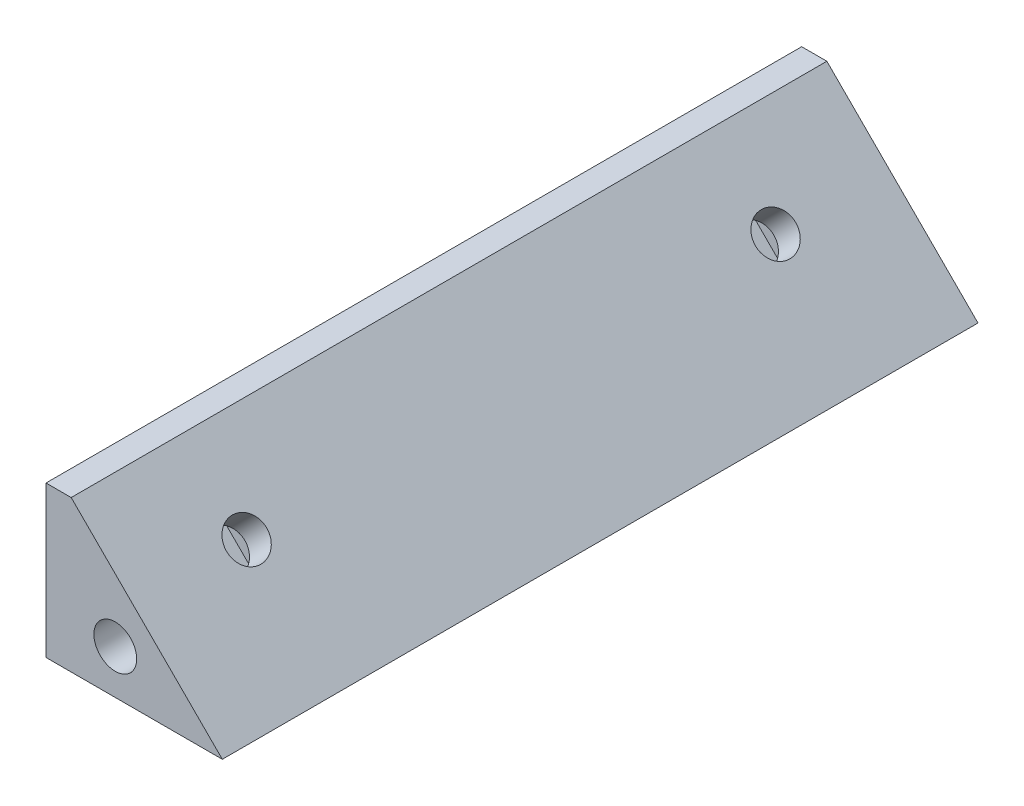
ISO-10303-21;
HEADER;
FILE_DESCRIPTION(('STEP AP214'),'2;1');
FILE_NAME('part.step','',(''),(''),'','','');
FILE_SCHEMA(('AUTOMOTIVE_DESIGN { 1 0 10303 214 1 1 1 1 }'));
ENDSEC;
DATA;
#1=APPLICATION_CONTEXT('core data for automotive mechanical design processes');
#2=APPLICATION_PROTOCOL_DEFINITION('international standard','automotive_design',2000,#1);
#3=PRODUCT_CONTEXT('',#1,'mechanical');
#4=PRODUCT('Part','Part','',(#3));
#5=PRODUCT_RELATED_PRODUCT_CATEGORY('part','',(#4));
#6=PRODUCT_DEFINITION_FORMATION('','',#4);
#7=PRODUCT_DEFINITION_CONTEXT('part definition',#1,'design');
#8=PRODUCT_DEFINITION('design','',#6,#7);
#9=PRODUCT_DEFINITION_SHAPE('','',#8);
#10=(LENGTH_UNIT() NAMED_UNIT(*) SI_UNIT(.MILLI.,.METRE.));
#11=(NAMED_UNIT(*) PLANE_ANGLE_UNIT() SI_UNIT($,.RADIAN.));
#12=(NAMED_UNIT(*) SI_UNIT($,.STERADIAN.) SOLID_ANGLE_UNIT());
#13=UNCERTAINTY_MEASURE_WITH_UNIT(LENGTH_MEASURE(1.E-05),#10,'distance_accuracy_value','');
#14=(GEOMETRIC_REPRESENTATION_CONTEXT(3) GLOBAL_UNCERTAINTY_ASSIGNED_CONTEXT((#13)) GLOBAL_UNIT_ASSIGNED_CONTEXT((#10,
#11,#12)) REPRESENTATION_CONTEXT('',''));
#15=CARTESIAN_POINT('',(0.,0.,0.));
#16=DIRECTION('',(0.,0.,1.));
#17=DIRECTION('',(1.,0.,0.));
#18=AXIS2_PLACEMENT_3D('',#15,#16,#17);
#19=CARTESIAN_POINT('',(4.26758838609296,4.26758838609296,0.));
#20=DIRECTION('',(0.707106781186548,0.707106781186547,0.));
#21=DIRECTION('',(-0.707106781186547,0.707106781186548,0.));
#22=AXIS2_PLACEMENT_3D('',#19,#20,#21);
#23=PLANE('',#22);
#24=CARTESIAN_POINT('',(3.19652057422748,5.33865619795844,9.));
#25=DIRECTION('',(0.707106781186548,0.707106781186547,0.));
#26=DIRECTION('',(-0.707106781186547,0.707106781186548,0.));
#27=AXIS2_PLACEMENT_3D('',#24,#25,#26);
#28=CIRCLE('',#27,1.6);
#29=CARTESIAN_POINT('',(2.06514972432901,6.47002704785692,9.));
#30=VERTEX_POINT('',#29);
#31=EDGE_CURVE('E362',#30,#30,#28,.T.);
#32=ORIENTED_EDGE('',*,*,#31,.T.);
#33=EDGE_LOOP('',(#32));
#34=FACE_BOUND('',#33,.T.);
#35=DIRECTION('',(-0.707106781186547,0.707106781186548,0.));
#36=VECTOR('',#35,1.);
#37=CARTESIAN_POINT('',(4.26758838609296,4.26758838609296,6.175));
#38=LINE('',#37,#36);
#39=CARTESIAN_POINT('',(8.53517677218592,0.,6.175));
#40=VERTEX_POINT('',#39);
#41=CARTESIAN_POINT('',(2.04321915366707,6.49195761851885,6.175));
#42=VERTEX_POINT('',#41);
#43=EDGE_CURVE('E373',#40,#42,#38,.T.);
#44=ORIENTED_EDGE('',*,*,#43,.F.);
#45=DIRECTION('',(0.,0.,1.));
#46=VECTOR('',#45,1.);
#47=CARTESIAN_POINT('',(8.53517677218592,0.,0.));
#48=LINE('',#47,#46);
#49=CARTESIAN_POINT('',(8.53517677218592,0.,11.825));
#50=VERTEX_POINT('',#49);
#51=EDGE_CURVE('E613',#40,#50,#48,.T.);
#52=ORIENTED_EDGE('',*,*,#51,.T.);
#53=DIRECTION('',(-0.707106781186547,0.707106781186548,0.));
#54=VECTOR('',#53,1.);
#55=CARTESIAN_POINT('',(4.26758838609296,4.26758838609296,11.825));
#56=LINE('',#55,#54);
#57=CARTESIAN_POINT('',(2.04321915366707,6.49195761851886,11.825));
#58=VERTEX_POINT('',#57);
#59=EDGE_CURVE('E370',#50,#58,#56,.T.);
#60=ORIENTED_EDGE('',*,*,#59,.T.);
#61=DIRECTION('',(-0.353553390593274,0.353553390593274,-0.866025403784439));
#62=VECTOR('',#61,1.);
#63=CARTESIAN_POINT('',(-1.02134056427785,9.55651733646377,4.31839240474743));
#64=LINE('',#63,#62);
#65=CARTESIAN_POINT('',(0.889917733106655,7.64525903907927,9.00000000000001));
#66=VERTEX_POINT('',#65);
#67=EDGE_CURVE('E365',#58,#66,#64,.T.);
#68=ORIENTED_EDGE('',*,*,#67,.T.);
#69=DIRECTION('',(0.353553390593273,-0.353553390593274,-0.866025403784439));
#70=VECTOR('',#69,1.);
#71=CARTESIAN_POINT('',(4.49001135698431,4.04516541520162,0.181607595252568));
#72=LINE('',#71,#70);
#73=EDGE_CURVE('E417',#66,#42,#72,.T.);
#74=ORIENTED_EDGE('',*,*,#73,.T.);
#75=EDGE_LOOP('',(#44,#52,#60,#68,#74));
#76=FACE_BOUND('',#75,.T.);
#77=ADVANCED_FACE('F124',(#34,#76),#23,.F.);
#78=CARTESIAN_POINT('',(0.,0.,30.));
#79=DIRECTION('',(0.,1.,0.));
#80=DIRECTION('',(0.,0.,1.));
#81=AXIS2_PLACEMENT_3D('',#78,#79,#80);
#82=PLANE('',#81);
#83=DIRECTION('',(0.,0.,-1.));
#84=VECTOR('',#83,1.);
#85=CARTESIAN_POINT('',(10.6693372220188,0.,5.));
#86=LINE('',#85,#84);
#87=CARTESIAN_POINT('',(10.6693372220189,0.,5.));
#88=VERTEX_POINT('',#87);
#89=CARTESIAN_POINT('',(10.6693372220188,0.,2.45));
#90=VERTEX_POINT('',#89);
#91=EDGE_CURVE('E355',#88,#90,#86,.T.);
#92=ORIENTED_EDGE('',*,*,#91,.T.);
#93=DIRECTION('',(1.,0.,0.));
#94=VECTOR('',#93,1.);
#95=CARTESIAN_POINT('',(0.,0.,2.45));
#96=LINE('',#95,#94);
#97=CARTESIAN_POINT('',(2.91347758001106,0.,2.45));
#98=VERTEX_POINT('',#97);
#99=EDGE_CURVE('E325',#98,#90,#96,.T.);
#100=ORIENTED_EDGE('',*,*,#99,.F.);
#101=DIRECTION('',(0.,0.,-1.));
#102=VECTOR('',#101,1.);
#103=CARTESIAN_POINT('',(2.91347758001106,0.,5.));
#104=LINE('',#103,#102);
#105=CARTESIAN_POINT('',(2.91347758001106,0.,5.));
#106=VERTEX_POINT('',#105);
#107=EDGE_CURVE('E358',#106,#98,#104,.T.);
#108=ORIENTED_EDGE('',*,*,#107,.F.);
#109=DIRECTION('',(1.,0.,0.));
#110=VECTOR('',#109,1.);
#111=CARTESIAN_POINT('',(0.,0.,5.));
#112=LINE('',#111,#110);
#113=EDGE_CURVE('E338',#106,#88,#112,.T.);
#114=ORIENTED_EDGE('',*,*,#113,.T.);
#115=EDGE_LOOP('',(#92,#100,#108,#114));
#116=FACE_BOUND('',#115,.T.);
#117=DIRECTION('',(1.,0.,0.));
#118=VECTOR('',#117,1.);
#119=CARTESIAN_POINT('',(0.,0.,0.));
#120=LINE('',#119,#118);
#121=CARTESIAN_POINT('',(-2.,0.,0.));
#122=VERTEX_POINT('',#121);
#123=CARTESIAN_POINT('',(12.,0.,0.));
#124=VERTEX_POINT('',#123);
#125=EDGE_CURVE('E305',#122,#124,#120,.T.);
#126=ORIENTED_EDGE('',*,*,#125,.T.);
#127=DIRECTION('',(0.,0.,-1.));
#128=VECTOR('',#127,1.);
#129=CARTESIAN_POINT('',(12.,0.,30.));
#130=LINE('',#129,#128);
#131=CARTESIAN_POINT('',(12.,0.,60.));
#132=VERTEX_POINT('',#131);
#133=EDGE_CURVE('E303',#132,#124,#130,.T.);
#134=ORIENTED_EDGE('',*,*,#133,.F.);
#135=DIRECTION('',(1.,0.,0.));
#136=VECTOR('',#135,1.);
#137=CARTESIAN_POINT('',(0.,0.,60.));
#138=LINE('',#137,#136);
#139=CARTESIAN_POINT('',(-2.,0.,60.));
#140=VERTEX_POINT('',#139);
#141=EDGE_CURVE('E288',#140,#132,#138,.T.);
#142=ORIENTED_EDGE('',*,*,#141,.F.);
#143=DIRECTION('',(0.,0.,-1.));
#144=VECTOR('',#143,1.);
#145=CARTESIAN_POINT('',(-2.,0.,30.));
#146=LINE('',#145,#144);
#147=EDGE_CURVE('E402',#140,#122,#146,.T.);
#148=ORIENTED_EDGE('',*,*,#147,.T.);
#149=EDGE_LOOP('',(#126,#134,#142,#148));
#150=FACE_BOUND('',#149,.T.);
#151=DIRECTION('',(1.,0.,0.));
#152=VECTOR('',#151,1.);
#153=CARTESIAN_POINT('',(0.,0.,11.825));
#154=LINE('',#153,#152);
#155=CARTESIAN_POINT('',(4.92893218813453,0.,11.825));
#156=VERTEX_POINT('',#155);
#157=EDGE_CURVE('E391',#156,#50,#154,.T.);
#158=ORIENTED_EDGE('',*,*,#157,.T.);
#159=ORIENTED_EDGE('',*,*,#51,.F.);
#160=DIRECTION('',(1.,0.,0.));
#161=VECTOR('',#160,1.);
#162=CARTESIAN_POINT('',(0.,0.,6.175));
#163=LINE('',#162,#161);
#164=CARTESIAN_POINT('',(4.92893218813453,0.,6.175));
#165=VERTEX_POINT('',#164);
#166=EDGE_CURVE('E399',#165,#40,#163,.T.);
#167=ORIENTED_EDGE('',*,*,#166,.F.);
#168=DIRECTION('',(0.,0.,-1.));
#169=VECTOR('',#168,1.);
#170=CARTESIAN_POINT('',(4.92893218813453,0.,30.));
#171=LINE('',#170,#169);
#172=EDGE_CURVE('E309',#156,#165,#171,.T.);
#173=ORIENTED_EDGE('',*,*,#172,.F.);
#174=EDGE_LOOP('',(#158,#159,#167,#173));
#175=FACE_BOUND('',#174,.T.);
#176=DIRECTION('',(1.,0.,0.));
#177=VECTOR('',#176,1.);
#178=CARTESIAN_POINT('',(0.,0.,53.825));
#179=LINE('',#178,#177);
#180=CARTESIAN_POINT('',(4.92893218813453,0.,53.825));
#181=VERTEX_POINT('',#180);
#182=CARTESIAN_POINT('',(8.53517677218592,0.,53.825));
#183=VERTEX_POINT('',#182);
#184=EDGE_CURVE('E446',#181,#183,#179,.T.);
#185=ORIENTED_EDGE('',*,*,#184,.T.);
#186=CARTESIAN_POINT('',(8.53517677218592,0.,48.175));
#187=VERTEX_POINT('',#186);
#188=EDGE_CURVE('E444',#187,#183,#48,.T.);
#189=ORIENTED_EDGE('',*,*,#188,.F.);
#190=DIRECTION('',(1.,0.,0.));
#191=VECTOR('',#190,1.);
#192=CARTESIAN_POINT('',(0.,0.,48.175));
#193=LINE('',#192,#191);
#194=CARTESIAN_POINT('',(4.92893218813453,0.,48.175));
#195=VERTEX_POINT('',#194);
#196=EDGE_CURVE('E438',#195,#187,#193,.T.);
#197=ORIENTED_EDGE('',*,*,#196,.F.);
#198=DIRECTION('',(0.,0.,-1.));
#199=VECTOR('',#198,1.);
#200=CARTESIAN_POINT('',(4.92893218813453,0.,30.));
#201=LINE('',#200,#199);
#202=EDGE_CURVE('E132',#181,#195,#201,.T.);
#203=ORIENTED_EDGE('',*,*,#202,.F.);
#204=EDGE_LOOP('',(#185,#189,#197,#203));
#205=FACE_BOUND('',#204,.T.);
#206=DIRECTION('',(1.,0.,0.));
#207=VECTOR('',#206,1.);
#208=CARTESIAN_POINT('',(0.,0.,55.));
#209=LINE('',#208,#207);
#210=CARTESIAN_POINT('',(2.91347758001106,0.,55.));
#211=VERTEX_POINT('',#210);
#212=CARTESIAN_POINT('',(10.6693372220189,0.,55.));
#213=VERTEX_POINT('',#212);
#214=EDGE_CURVE('E625',#211,#213,#209,.T.);
#215=ORIENTED_EDGE('',*,*,#214,.F.);
#216=DIRECTION('',(0.,0.,1.));
#217=VECTOR('',#216,1.);
#218=CARTESIAN_POINT('',(2.91347758001106,0.,55.));
#219=LINE('',#218,#217);
#220=CARTESIAN_POINT('',(2.91347758001106,0.,57.55));
#221=VERTEX_POINT('',#220);
#222=EDGE_CURVE('E628',#211,#221,#219,.T.);
#223=ORIENTED_EDGE('',*,*,#222,.T.);
#224=DIRECTION('',(1.,0.,0.));
#225=VECTOR('',#224,1.);
#226=CARTESIAN_POINT('',(0.,0.,57.55));
#227=LINE('',#226,#225);
#228=CARTESIAN_POINT('',(10.6693372220188,0.,57.55));
#229=VERTEX_POINT('',#228);
#230=EDGE_CURVE('E598',#221,#229,#227,.T.);
#231=ORIENTED_EDGE('',*,*,#230,.T.);
#232=DIRECTION('',(0.,0.,1.));
#233=VECTOR('',#232,1.);
#234=CARTESIAN_POINT('',(10.6693372220188,0.,55.));
#235=LINE('',#234,#233);
#236=EDGE_CURVE('E630',#213,#229,#235,.T.);
#237=ORIENTED_EDGE('',*,*,#236,.F.);
#238=EDGE_LOOP('',(#215,#223,#231,#237));
#239=FACE_BOUND('',#238,.T.);
#240=ADVANCED_FACE('F126',(#116,#150,#175,#205,#239),#82,.F.);
#241=CARTESIAN_POINT('',(2.46446609406727,2.46446609406727,53.825));
#242=DIRECTION('',(0.,0.,1.));
#243=DIRECTION('',(0.,-1.,0.));
#244=AXIS2_PLACEMENT_3D('',#241,#242,#243);
#245=PLANE('',#244);
#246=DIRECTION('',(-0.707106781186547,0.707106781186548,0.));
#247=VECTOR('',#246,1.);
#248=CARTESIAN_POINT('',(4.26758838609296,4.26758838609296,53.825));
#249=LINE('',#248,#247);
#250=CARTESIAN_POINT('',(2.04321915366707,6.49195761851885,53.825));
#251=VERTEX_POINT('',#250);
#252=EDGE_CURVE('E527',#183,#251,#249,.T.);
#253=ORIENTED_EDGE('',*,*,#252,.F.);
#254=ORIENTED_EDGE('',*,*,#184,.F.);
#255=DIRECTION('',(0.707106781186547,-0.707106781186548,0.));
#256=VECTOR('',#255,1.);
#257=CARTESIAN_POINT('',(2.46446609406727,2.46446609406727,53.825));
#258=LINE('',#257,#256);
#259=CARTESIAN_POINT('',(0.240096861641371,4.68883532649316,53.825));
#260=VERTEX_POINT('',#259);
#261=EDGE_CURVE('E429',#260,#181,#258,.T.);
#262=ORIENTED_EDGE('',*,*,#261,.F.);
#263=DIRECTION('',(0.707106781186548,0.707106781186547,0.));
#264=VECTOR('',#263,1.);
#265=CARTESIAN_POINT('',(0.240096861641371,4.68883532649316,53.825));
#266=LINE('',#265,#264);
#267=EDGE_CURVE('E447',#260,#251,#266,.T.);
#268=ORIENTED_EDGE('',*,*,#267,.T.);
#269=EDGE_LOOP('',(#253,#254,#262,#268));
#270=FACE_BOUND('',#269,.T.);
#271=ADVANCED_FACE('F492',(#270),#245,.F.);
#272=CARTESIAN_POINT('',(2.46446609406727,2.46446609406727,48.175));
#273=DIRECTION('',(0.,0.,1.));
#274=DIRECTION('',(1.,0.,0.));
#275=AXIS2_PLACEMENT_3D('',#272,#273,#274);
#276=PLANE('',#275);
#277=ORIENTED_EDGE('',*,*,#196,.T.);
#278=DIRECTION('',(-0.707106781186547,0.707106781186548,0.));
#279=VECTOR('',#278,1.);
#280=CARTESIAN_POINT('',(4.26758838609296,4.26758838609296,48.175));
#281=LINE('',#280,#279);
#282=CARTESIAN_POINT('',(2.04321915366707,6.49195761851886,48.175));
#283=VERTEX_POINT('',#282);
#284=EDGE_CURVE('E510',#187,#283,#281,.T.);
#285=ORIENTED_EDGE('',*,*,#284,.T.);
#286=DIRECTION('',(0.707106781186548,0.707106781186547,0.));
#287=VECTOR('',#286,1.);
#288=CARTESIAN_POINT('',(0.240096861641371,4.68883532649316,48.175));
#289=LINE('',#288,#287);
#290=CARTESIAN_POINT('',(0.240096861641371,4.68883532649316,48.175));
#291=VERTEX_POINT('',#290);
#292=EDGE_CURVE('E440',#291,#283,#289,.T.);
#293=ORIENTED_EDGE('',*,*,#292,.F.);
#294=DIRECTION('',(0.707106781186547,-0.707106781186548,0.));
#295=VECTOR('',#294,1.);
#296=CARTESIAN_POINT('',(2.46446609406727,2.46446609406727,48.175));
#297=LINE('',#296,#295);
#298=EDGE_CURVE('E426',#291,#195,#297,.T.);
#299=ORIENTED_EDGE('',*,*,#298,.T.);
#300=EDGE_LOOP('',(#277,#285,#293,#299));
#301=FACE_BOUND('',#300,.T.);
#302=ADVANCED_FACE('F436',(#301),#276,.T.);
#303=CARTESIAN_POINT('',(2.68688906495861,2.24204312317592,59.8183924047474));
#304=DIRECTION('',(0.612372435695795,-0.612372435695795,-0.5));
#305=DIRECTION('',(0.707106781186548,0.707106781186547,0.));
#306=AXIS2_PLACEMENT_3D('',#303,#304,#305);
#307=PLANE('',#306);
#308=DIRECTION('',(0.707106781186548,0.707106781186547,0.));
#309=VECTOR('',#308,1.);
#310=CARTESIAN_POINT('',(-0.913204558919042,5.84213674705358,51.));
#311=LINE('',#310,#309);
#312=CARTESIAN_POINT('',(-0.913204558919042,5.84213674705358,51.));
#313=VERTEX_POINT('',#312);
#314=CARTESIAN_POINT('',(0.889917733106652,7.64525903907927,51.));
#315=VERTEX_POINT('',#314);
#316=EDGE_CURVE('E451',#313,#315,#311,.T.);
#317=ORIENTED_EDGE('',*,*,#316,.T.);
#318=DIRECTION('',(0.353553390593273,-0.353553390593274,0.866025403784439));
#319=VECTOR('',#318,1.);
#320=CARTESIAN_POINT('',(4.49001135698431,4.04516541520162,59.8183924047474));
#321=LINE('',#320,#319);
#322=EDGE_CURVE('E515',#315,#251,#321,.T.);
#323=ORIENTED_EDGE('',*,*,#322,.T.);
#324=ORIENTED_EDGE('',*,*,#267,.F.);
#325=DIRECTION('',(-0.353553390593273,0.353553390593274,-0.866025403784439));
#326=VECTOR('',#325,1.);
#327=CARTESIAN_POINT('',(2.68688906495861,2.24204312317592,59.8183924047474));
#328=LINE('',#327,#326);
#329=EDGE_CURVE('E531',#260,#313,#328,.T.);
#330=ORIENTED_EDGE('',*,*,#329,.T.);
#331=EDGE_LOOP('',(#317,#323,#324,#330));
#332=FACE_BOUND('',#331,.T.);
#333=ADVANCED_FACE('F538',(#332),#307,.T.);
#334=CARTESIAN_POINT('',(-2.82446285630354,7.75339504443808,55.6816075952526));
#335=DIRECTION('',(0.612372435695794,-0.612372435695795,0.5));
#336=DIRECTION('',(0.707106781186548,0.707106781186547,0.));
#337=AXIS2_PLACEMENT_3D('',#334,#335,#336);
#338=PLANE('',#337);
#339=ORIENTED_EDGE('',*,*,#292,.T.);
#340=DIRECTION('',(-0.353553390593274,0.353553390593274,0.866025403784439));
#341=VECTOR('',#340,1.);
#342=CARTESIAN_POINT('',(-1.02134056427785,9.55651733646377,55.6816075952526));
#343=LINE('',#342,#341);
#344=EDGE_CURVE('E12',#283,#315,#343,.T.);
#345=ORIENTED_EDGE('',*,*,#344,.T.);
#346=ORIENTED_EDGE('',*,*,#316,.F.);
#347=DIRECTION('',(0.353553390593274,-0.353553390593274,-0.866025403784439));
#348=VECTOR('',#347,1.);
#349=CARTESIAN_POINT('',(-2.82446285630354,7.75339504443808,55.6816075952526));
#350=LINE('',#349,#348);
#351=EDGE_CURVE('E441',#313,#291,#350,.T.);
#352=ORIENTED_EDGE('',*,*,#351,.T.);
#353=EDGE_LOOP('',(#339,#345,#346,#352));
#354=FACE_BOUND('',#353,.T.);
#355=ADVANCED_FACE('F466',(#354),#338,.T.);
#356=CARTESIAN_POINT('',(0.,0.,0.));
#357=DIRECTION('',(0.,0.,1.));
#358=DIRECTION('',(1.,0.,0.));
#359=AXIS2_PLACEMENT_3D('',#356,#357,#358);
#360=PLANE('',#359);
#361=DIRECTION('',(0.707106781186548,-0.707106781186548,0.));
#362=VECTOR('',#361,1.);
#363=CARTESIAN_POINT('',(6.,6.,0.));
#364=LINE('',#363,#362);
#365=CARTESIAN_POINT('',(0.,12.,0.));
#366=VERTEX_POINT('',#365);
#367=EDGE_CURVE('E413',#366,#124,#364,.T.);
#368=ORIENTED_EDGE('',*,*,#367,.T.);
#369=ORIENTED_EDGE('',*,*,#125,.F.);
#370=DIRECTION('',(0.,1.,0.));
#371=VECTOR('',#370,1.);
#372=CARTESIAN_POINT('',(-2.,0.,0.));
#373=LINE('',#372,#371);
#374=CARTESIAN_POINT('',(-2.,12.,0.));
#375=VERTEX_POINT('',#374);
#376=EDGE_CURVE('E403',#122,#375,#373,.T.);
#377=ORIENTED_EDGE('',*,*,#376,.T.);
#378=DIRECTION('',(-1.,0.,0.));
#379=VECTOR('',#378,1.);
#380=CARTESIAN_POINT('',(0.,12.,0.));
#381=LINE('',#380,#379);
#382=EDGE_CURVE('E406',#366,#375,#381,.T.);
#383=ORIENTED_EDGE('',*,*,#382,.F.);
#384=EDGE_LOOP('',(#368,#369,#377,#383));
#385=FACE_BOUND('',#384,.T.);
#386=CARTESIAN_POINT('',(3.5,3.5,0.));
#387=DIRECTION('',(0.,0.,1.));
#388=DIRECTION('',(1.,0.,0.));
#389=AXIS2_PLACEMENT_3D('',#386,#387,#388);
#390=CIRCLE('',#389,1.7);
#391=CARTESIAN_POINT('',(5.2,3.5,0.));
#392=VERTEX_POINT('',#391);
#393=EDGE_CURVE('E300',#392,#392,#390,.T.);
#394=ORIENTED_EDGE('',*,*,#393,.T.);
#395=EDGE_LOOP('',(#394));
#396=FACE_BOUND('',#395,.T.);
#397=ADVANCED_FACE('F462',(#385,#396),#360,.F.);
#398=CARTESIAN_POINT('',(2.46446609406727,2.46446609406727,6.175));
#399=DIRECTION('',(0.,0.,1.));
#400=DIRECTION('',(0.,-1.,0.));
#401=AXIS2_PLACEMENT_3D('',#398,#399,#400);
#402=PLANE('',#401);
#403=ORIENTED_EDGE('',*,*,#166,.T.);
#404=ORIENTED_EDGE('',*,*,#43,.T.);
#405=DIRECTION('',(0.707106781186548,0.707106781186547,0.));
#406=VECTOR('',#405,1.);
#407=CARTESIAN_POINT('',(0.240096861641371,4.68883532649316,6.175));
#408=LINE('',#407,#406);
#409=CARTESIAN_POINT('',(0.240096861641371,4.68883532649316,6.175));
#410=VERTEX_POINT('',#409);
#411=EDGE_CURVE('E387',#410,#42,#408,.T.);
#412=ORIENTED_EDGE('',*,*,#411,.F.);
#413=DIRECTION('',(0.707106781186547,-0.707106781186548,0.));
#414=VECTOR('',#413,1.);
#415=CARTESIAN_POINT('',(2.46446609406727,2.46446609406727,6.175));
#416=LINE('',#415,#414);
#417=EDGE_CURVE('E375',#410,#165,#416,.T.);
#418=ORIENTED_EDGE('',*,*,#417,.T.);
#419=EDGE_LOOP('',(#403,#404,#412,#418));
#420=FACE_BOUND('',#419,.T.);
#421=ADVANCED_FACE('F465',(#420),#402,.T.);
#422=CARTESIAN_POINT('',(2.46446609406727,2.46446609406727,11.825));
#423=DIRECTION('',(0.,0.,1.));
#424=DIRECTION('',(1.,0.,0.));
#425=AXIS2_PLACEMENT_3D('',#422,#423,#424);
#426=PLANE('',#425);
#427=ORIENTED_EDGE('',*,*,#59,.F.);
#428=ORIENTED_EDGE('',*,*,#157,.F.);
#429=DIRECTION('',(0.707106781186547,-0.707106781186548,0.));
#430=VECTOR('',#429,1.);
#431=CARTESIAN_POINT('',(2.46446609406727,2.46446609406727,11.825));
#432=LINE('',#431,#430);
#433=CARTESIAN_POINT('',(0.240096861641371,4.68883532649316,11.825));
#434=VERTEX_POINT('',#433);
#435=EDGE_CURVE('E384',#434,#156,#432,.T.);
#436=ORIENTED_EDGE('',*,*,#435,.F.);
#437=DIRECTION('',(0.707106781186548,0.707106781186547,0.));
#438=VECTOR('',#437,1.);
#439=CARTESIAN_POINT('',(0.240096861641371,4.68883532649316,11.825));
#440=LINE('',#439,#438);
#441=EDGE_CURVE('E388',#434,#58,#440,.T.);
#442=ORIENTED_EDGE('',*,*,#441,.T.);
#443=EDGE_LOOP('',(#427,#428,#436,#442));
#444=FACE_BOUND('',#443,.T.);
#445=ADVANCED_FACE('F646',(#444),#426,.F.);
#446=CARTESIAN_POINT('',(-2.82446285630354,7.75339504443808,4.31839240474743));
#447=DIRECTION('',(-0.612372435695794,0.612372435695795,0.5));
#448=DIRECTION('',(-0.707106781186548,-0.707106781186547,0.));
#449=AXIS2_PLACEMENT_3D('',#446,#447,#448);
#450=PLANE('',#449);
#451=ORIENTED_EDGE('',*,*,#67,.F.);
#452=ORIENTED_EDGE('',*,*,#441,.F.);
#453=DIRECTION('',(0.353553390593274,-0.353553390593274,0.866025403784439));
#454=VECTOR('',#453,1.);
#455=CARTESIAN_POINT('',(-2.82446285630354,7.75339504443808,4.31839240474743));
#456=LINE('',#455,#454);
#457=CARTESIAN_POINT('',(-0.913204558919042,5.84213674705358,9.));
#458=VERTEX_POINT('',#457);
#459=EDGE_CURVE('E381',#458,#434,#456,.T.);
#460=ORIENTED_EDGE('',*,*,#459,.F.);
#461=DIRECTION('',(0.707106781186548,0.707106781186547,0.));
#462=VECTOR('',#461,1.);
#463=CARTESIAN_POINT('',(-0.913204558919042,5.84213674705358,9.));
#464=LINE('',#463,#462);
#465=EDGE_CURVE('E392',#458,#66,#464,.T.);
#466=ORIENTED_EDGE('',*,*,#465,.T.);
#467=EDGE_LOOP('',(#451,#452,#460,#466));
#468=FACE_BOUND('',#467,.T.);
#469=ADVANCED_FACE('F655',(#468),#450,.F.);
#470=CARTESIAN_POINT('',(2.68688906495861,2.24204312317592,0.181607595252568));
#471=DIRECTION('',(-0.612372435695795,0.612372435695795,-0.5));
#472=DIRECTION('',(-0.707106781186548,-0.707106781186547,0.));
#473=AXIS2_PLACEMENT_3D('',#470,#471,#472);
#474=PLANE('',#473);
#475=ORIENTED_EDGE('',*,*,#73,.F.);
#476=ORIENTED_EDGE('',*,*,#465,.F.);
#477=DIRECTION('',(-0.353553390593273,0.353553390593274,0.866025403784439));
#478=VECTOR('',#477,1.);
#479=CARTESIAN_POINT('',(2.68688906495861,2.24204312317592,0.181607595252568));
#480=LINE('',#479,#478);
#481=EDGE_CURVE('E378',#410,#458,#480,.T.);
#482=ORIENTED_EDGE('',*,*,#481,.F.);
#483=ORIENTED_EDGE('',*,*,#411,.T.);
#484=EDGE_LOOP('',(#475,#476,#482,#483));
#485=FACE_BOUND('',#484,.T.);
#486=ADVANCED_FACE('F653',(#485),#474,.F.);
#487=CARTESIAN_POINT('',(6.,6.,30.));
#488=DIRECTION('',(0.707106781186547,0.707106781186547,0.));
#489=DIRECTION('',(-0.707106781186548,0.707106781186548,0.));
#490=AXIS2_PLACEMENT_3D('',#487,#488,#489);
#491=PLANE('',#490);
#492=DIRECTION('',(0.707106781186548,-0.707106781186548,0.));
#493=VECTOR('',#492,1.);
#494=CARTESIAN_POINT('',(6.,6.,60.));
#495=LINE('',#494,#493);
#496=CARTESIAN_POINT('',(0.,12.,60.));
#497=VERTEX_POINT('',#496);
#498=EDGE_CURVE('E294',#497,#132,#495,.T.);
#499=ORIENTED_EDGE('',*,*,#498,.T.);
#500=ORIENTED_EDGE('',*,*,#133,.T.);
#501=ORIENTED_EDGE('',*,*,#367,.F.);
#502=DIRECTION('',(0.,0.,-1.));
#503=VECTOR('',#502,1.);
#504=CARTESIAN_POINT('',(0.,12.,30.));
#505=LINE('',#504,#503);
#506=EDGE_CURVE('E310',#497,#366,#505,.T.);
#507=ORIENTED_EDGE('',*,*,#506,.F.);
#508=EDGE_LOOP('',(#499,#500,#501,#507));
#509=FACE_BOUND('',#508,.T.);
#510=CARTESIAN_POINT('',(4.92893218813452,7.07106781186548,51.));
#511=DIRECTION('',(-0.707106781186548,-0.707106781186547,0.));
#512=DIRECTION('',(-0.707106781186547,0.707106781186548,0.));
#513=AXIS2_PLACEMENT_3D('',#510,#511,#512);
#514=CIRCLE('',#513,1.6);
#515=CARTESIAN_POINT('',(3.79756133823605,8.20243866176396,51.));
#516=VERTEX_POINT('',#515);
#517=EDGE_CURVE('E516',#516,#516,#514,.T.);
#518=ORIENTED_EDGE('',*,*,#517,.T.);
#519=EDGE_LOOP('',(#518));
#520=FACE_BOUND('',#519,.T.);
#521=CARTESIAN_POINT('',(4.92893218813452,7.07106781186548,9.));
#522=DIRECTION('',(0.707106781186548,0.707106781186547,0.));
#523=DIRECTION('',(-0.707106781186547,0.707106781186548,0.));
#524=AXIS2_PLACEMENT_3D('',#521,#522,#523);
#525=CIRCLE('',#524,1.6);
#526=CARTESIAN_POINT('',(3.79756133823605,8.20243866176396,9.));
#527=VERTEX_POINT('',#526);
#528=EDGE_CURVE('E361',#527,#527,#525,.T.);
#529=ORIENTED_EDGE('',*,*,#528,.F.);
#530=EDGE_LOOP('',(#529));
#531=FACE_BOUND('',#530,.T.);
#532=ADVANCED_FACE('F312',(#509,#520,#531),#491,.T.);
#533=CARTESIAN_POINT('',(-2.,0.,30.));
#534=DIRECTION('',(-1.,0.,0.));
#535=DIRECTION('',(0.,-1.,0.));
#536=AXIS2_PLACEMENT_3D('',#533,#534,#535);
#537=PLANE('',#536);
#538=ORIENTED_EDGE('',*,*,#376,.F.);
#539=ORIENTED_EDGE('',*,*,#147,.F.);
#540=DIRECTION('',(0.,1.,0.));
#541=VECTOR('',#540,1.);
#542=CARTESIAN_POINT('',(-2.,0.,60.));
#543=LINE('',#542,#541);
#544=CARTESIAN_POINT('',(-2.,12.,60.));
#545=VERTEX_POINT('',#544);
#546=EDGE_CURVE('E297',#140,#545,#543,.T.);
#547=ORIENTED_EDGE('',*,*,#546,.T.);
#548=DIRECTION('',(0.,0.,-1.));
#549=VECTOR('',#548,1.);
#550=CARTESIAN_POINT('',(-2.,12.,30.));
#551=LINE('',#550,#549);
#552=EDGE_CURVE('E409',#545,#375,#551,.T.);
#553=ORIENTED_EDGE('',*,*,#552,.T.);
#554=EDGE_LOOP('',(#538,#539,#547,#553));
#555=FACE_BOUND('',#554,.T.);
#556=ADVANCED_FACE('F457',(#555),#537,.T.);
#557=CARTESIAN_POINT('',(0.,12.,30.));
#558=DIRECTION('',(0.,-1.,0.));
#559=DIRECTION('',(0.,0.,-1.));
#560=AXIS2_PLACEMENT_3D('',#557,#558,#559);
#561=PLANE('',#560);
#562=ORIENTED_EDGE('',*,*,#382,.T.);
#563=ORIENTED_EDGE('',*,*,#552,.F.);
#564=DIRECTION('',(-1.,0.,0.));
#565=VECTOR('',#564,1.);
#566=CARTESIAN_POINT('',(0.,12.,60.));
#567=LINE('',#566,#565);
#568=EDGE_CURVE('E314',#497,#545,#567,.T.);
#569=ORIENTED_EDGE('',*,*,#568,.F.);
#570=ORIENTED_EDGE('',*,*,#506,.T.);
#571=EDGE_LOOP('',(#562,#563,#569,#570));
#572=FACE_BOUND('',#571,.T.);
#573=ADVANCED_FACE('F459',(#572),#561,.F.);
#574=CARTESIAN_POINT('',(2.46446609406727,2.46446609406727,0.));
#575=DIRECTION('',(0.707106781186548,0.707106781186547,0.));
#576=DIRECTION('',(-0.707106781186547,0.707106781186548,0.));
#577=AXIS2_PLACEMENT_3D('',#574,#575,#576);
#578=PLANE('',#577);
#579=ORIENTED_EDGE('',*,*,#172,.T.);
#580=ORIENTED_EDGE('',*,*,#417,.F.);
#581=ORIENTED_EDGE('',*,*,#481,.T.);
#582=ORIENTED_EDGE('',*,*,#459,.T.);
#583=ORIENTED_EDGE('',*,*,#435,.T.);
#584=EDGE_LOOP('',(#579,#580,#581,#582,#583));
#585=FACE_BOUND('',#584,.T.);
#586=ADVANCED_FACE('F499',(#585),#578,.T.);
#587=ORIENTED_EDGE('',*,*,#284,.F.);
#588=ORIENTED_EDGE('',*,*,#188,.T.);
#589=ORIENTED_EDGE('',*,*,#252,.T.);
#590=ORIENTED_EDGE('',*,*,#322,.F.);
#591=ORIENTED_EDGE('',*,*,#344,.F.);
#592=EDGE_LOOP('',(#587,#588,#589,#590,#591));
#593=FACE_BOUND('',#592,.T.);
#594=CARTESIAN_POINT('',(3.19652057422748,5.33865619795844,51.));
#595=DIRECTION('',(-0.707106781186548,-0.707106781186547,0.));
#596=DIRECTION('',(-0.707106781186547,0.707106781186548,0.));
#597=AXIS2_PLACEMENT_3D('',#594,#595,#596);
#598=CIRCLE('',#597,1.6);
#599=CARTESIAN_POINT('',(2.06514972432901,6.47002704785692,51.));
#600=VERTEX_POINT('',#599);
#601=EDGE_CURVE('E513',#600,#600,#598,.T.);
#602=ORIENTED_EDGE('',*,*,#601,.F.);
#603=EDGE_LOOP('',(#602));
#604=FACE_BOUND('',#603,.T.);
#605=ADVANCED_FACE('F488',(#593,#604),#23,.F.);
#606=CARTESIAN_POINT('',(3.19652057422748,5.33865619795844,9.));
#607=DIRECTION('',(0.707106781186548,0.707106781186548,0.));
#608=DIRECTION('',(-0.707106781186547,0.707106781186548,0.));
#609=AXIS2_PLACEMENT_3D('',#606,#607,#608);
#610=CYLINDRICAL_SURFACE('',#609,1.6);
#611=ORIENTED_EDGE('',*,*,#31,.F.);
#612=EDGE_LOOP('',(#611));
#613=FACE_BOUND('',#612,.T.);
#614=ORIENTED_EDGE('',*,*,#528,.T.);
#615=EDGE_LOOP('',(#614));
#616=FACE_BOUND('',#615,.T.);
#617=ADVANCED_FACE('F498',(#613,#616),#610,.F.);
#618=CARTESIAN_POINT('',(5.66205984737449,5.32461305332517,5.));
#619=DIRECTION('',(-0.728481465729226,-0.685065510800974,0.));
#620=DIRECTION('',(0.685065510800974,-0.728481465729226,0.));
#621=AXIS2_PLACEMENT_3D('',#618,#619,#620);
#622=PLANE('',#621);
#623=DIRECTION('',(-0.685065510800974,0.728481465729226,0.));
#624=VECTOR('',#623,1.);
#625=CARTESIAN_POINT('',(5.66205984737449,5.32461305332517,2.45));
#626=LINE('',#625,#624);
#627=CARTESIAN_POINT('',(4.44060835195251,6.62347390921879,2.45));
#628=VERTEX_POINT('',#627);
#629=EDGE_CURVE('E327',#90,#628,#626,.T.);
#630=ORIENTED_EDGE('',*,*,#629,.F.);
#631=ORIENTED_EDGE('',*,*,#91,.F.);
#632=DIRECTION('',(-0.685065510800974,0.728481465729226,0.));
#633=VECTOR('',#632,1.);
#634=CARTESIAN_POINT('',(5.66205984737449,5.32461305332517,5.));
#635=LINE('',#634,#633);
#636=CARTESIAN_POINT('',(4.44060835195251,6.62347390921879,5.));
#637=VERTEX_POINT('',#636);
#638=EDGE_CURVE('E340',#88,#637,#635,.T.);
#639=ORIENTED_EDGE('',*,*,#638,.T.);
#640=DIRECTION('',(0.,0.,-1.));
#641=VECTOR('',#640,1.);
#642=CARTESIAN_POINT('',(4.44060835195251,6.62347390921879,5.));
#643=LINE('',#642,#641);
#644=EDGE_CURVE('E352',#637,#628,#643,.T.);
#645=ORIENTED_EDGE('',*,*,#644,.T.);
#646=EDGE_LOOP('',(#630,#631,#639,#645));
#647=FACE_BOUND('',#646,.T.);
#648=ADVANCED_FACE('F505',(#647),#622,.T.);
#649=CARTESIAN_POINT('',(-1.24377549588123,5.28594675030155,5.));
#650=DIRECTION('',(0.229043402745593,-0.973416210908119,0.));
#651=DIRECTION('',(0.973416210908119,0.229043402745593,0.));
#652=AXIS2_PLACEMENT_3D('',#649,#650,#651);
#653=PLANE('',#652);
#654=DIRECTION('',(-0.973416210908119,-0.229043402745593,0.));
#655=VECTOR('',#654,1.);
#656=CARTESIAN_POINT('',(-1.24377549588123,5.28594675030155,2.45));
#657=LINE('',#656,#655);
#658=CARTESIAN_POINT('',(1.26529642253489,5.87632768241208,2.45));
#659=VERTEX_POINT('',#658);
#660=EDGE_CURVE('E329',#628,#659,#657,.T.);
#661=ORIENTED_EDGE('',*,*,#660,.F.);
#662=ORIENTED_EDGE('',*,*,#644,.F.);
#663=DIRECTION('',(-0.973416210908119,-0.229043402745593,0.));
#664=VECTOR('',#663,1.);
#665=CARTESIAN_POINT('',(-1.24377549588123,5.28594675030155,5.));
#666=LINE('',#665,#664);
#667=CARTESIAN_POINT('',(1.26529642253489,5.87632768241208,5.));
#668=VERTEX_POINT('',#667);
#669=EDGE_CURVE('E342',#637,#668,#666,.T.);
#670=ORIENTED_EDGE('',*,*,#669,.T.);
#671=DIRECTION('',(0.,0.,-1.));
#672=VECTOR('',#671,1.);
#673=CARTESIAN_POINT('',(1.26529642253489,5.87632768241208,5.));
#674=LINE('',#673,#672);
#675=EDGE_CURVE('E349',#668,#659,#674,.T.);
#676=ORIENTED_EDGE('',*,*,#675,.T.);
#677=EDGE_LOOP('',(#661,#662,#670,#676));
#678=FACE_BOUND('',#677,.T.);
#679=ADVANCED_FACE('F716',(#678),#653,.T.);
#680=CARTESIAN_POINT('',(-0.462379577005856,0.139241788004163,5.));
#681=DIRECTION('',(0.957524868474819,-0.288350700107146,0.));
#682=DIRECTION('',(0.288350700107146,0.957524868474819,0.));
#683=AXIS2_PLACEMENT_3D('',#680,#681,#682);
#684=PLANE('',#683);
#685=DIRECTION('',(-0.288350700107146,-0.957524868474819,0.));
#686=VECTOR('',#685,1.);
#687=CARTESIAN_POINT('',(-0.462379577005856,0.139241788004163,2.45));
#688=LINE('',#687,#686);
#689=CARTESIAN_POINT('',(0.324688070582382,2.75285377319329,2.45));
#690=VERTEX_POINT('',#689);
#691=EDGE_CURVE('E331',#659,#690,#688,.T.);
#692=ORIENTED_EDGE('',*,*,#691,.F.);
#693=ORIENTED_EDGE('',*,*,#675,.F.);
#694=DIRECTION('',(-0.288350700107146,-0.957524868474819,0.));
#695=VECTOR('',#694,1.);
#696=CARTESIAN_POINT('',(-0.462379577005856,0.139241788004163,5.));
#697=LINE('',#696,#695);
#698=CARTESIAN_POINT('',(0.324688070582382,2.75285377319329,5.));
#699=VERTEX_POINT('',#698);
#700=EDGE_CURVE('E344',#668,#699,#697,.T.);
#701=ORIENTED_EDGE('',*,*,#700,.T.);
#702=DIRECTION('',(0.,0.,-1.));
#703=VECTOR('',#702,1.);
#704=CARTESIAN_POINT('',(0.324688070582382,2.75285377319329,5.));
#705=LINE('',#704,#703);
#706=EDGE_CURVE('E346',#699,#690,#705,.T.);
#707=ORIENTED_EDGE('',*,*,#706,.T.);
#708=EDGE_LOOP('',(#692,#693,#701,#707));
#709=FACE_BOUND('',#708,.T.);
#710=ADVANCED_FACE('F721',(#709),#684,.T.);
#711=CARTESIAN_POINT('',(1.54613956600436,1.45399291729966,5.));
#712=DIRECTION('',(0.728481465729226,0.685065510800973,0.));
#713=DIRECTION('',(-0.685065510800973,0.728481465729226,0.));
#714=AXIS2_PLACEMENT_3D('',#711,#712,#713);
#715=PLANE('',#714);
#716=DIRECTION('',(0.685065510800973,-0.728481465729226,0.));
#717=VECTOR('',#716,1.);
#718=CARTESIAN_POINT('',(1.54613956600436,1.45399291729966,2.45));
#719=LINE('',#718,#717);
#720=EDGE_CURVE('E322',#690,#98,#719,.T.);
#721=ORIENTED_EDGE('',*,*,#720,.F.);
#722=ORIENTED_EDGE('',*,*,#706,.F.);
#723=DIRECTION('',(0.685065510800973,-0.728481465729226,0.));
#724=VECTOR('',#723,1.);
#725=CARTESIAN_POINT('',(1.54613956600436,1.45399291729966,5.));
#726=LINE('',#725,#724);
#727=EDGE_CURVE('E333',#699,#106,#726,.T.);
#728=ORIENTED_EDGE('',*,*,#727,.T.);
#729=ORIENTED_EDGE('',*,*,#107,.T.);
#730=EDGE_LOOP('',(#721,#722,#728,#729));
#731=FACE_BOUND('',#730,.T.);
#732=ADVANCED_FACE('F482',(#731),#715,.T.);
#733=CARTESIAN_POINT('',(0.,0.,5.));
#734=DIRECTION('',(0.,0.,1.));
#735=DIRECTION('',(1.,0.,0.));
#736=AXIS2_PLACEMENT_3D('',#733,#734,#735);
#737=PLANE('',#736);
#738=ORIENTED_EDGE('',*,*,#727,.F.);
#739=ORIENTED_EDGE('',*,*,#700,.F.);
#740=ORIENTED_EDGE('',*,*,#669,.F.);
#741=ORIENTED_EDGE('',*,*,#638,.F.);
#742=ORIENTED_EDGE('',*,*,#113,.F.);
#743=EDGE_LOOP('',(#738,#739,#740,#741,#742));
#744=FACE_BOUND('',#743,.T.);
#745=ADVANCED_FACE('F473',(#744),#737,.F.);
#746=CARTESIAN_POINT('',(3.5,3.5,2.45));
#747=DIRECTION('',(0.,0.,-1.));
#748=DIRECTION('',(-1.,0.,0.));
#749=AXIS2_PLACEMENT_3D('',#746,#747,#748);
#750=CYLINDRICAL_SURFACE('',#749,1.7);
#751=CARTESIAN_POINT('',(3.5,3.5,2.45));
#752=DIRECTION('',(0.,0.,1.));
#753=DIRECTION('',(1.,0.,0.));
#754=AXIS2_PLACEMENT_3D('',#751,#752,#753);
#755=CIRCLE('',#754,1.7);
#756=CARTESIAN_POINT('',(5.2,3.5,2.45));
#757=VERTEX_POINT('',#756);
#758=EDGE_CURVE('E319',#757,#757,#755,.T.);
#759=ORIENTED_EDGE('',*,*,#758,.T.);
#760=EDGE_LOOP('',(#759));
#761=FACE_BOUND('',#760,.T.);
#762=ORIENTED_EDGE('',*,*,#393,.F.);
#763=EDGE_LOOP('',(#762));
#764=FACE_BOUND('',#763,.T.);
#765=ADVANCED_FACE('F470',(#761,#764),#750,.F.);
#766=CARTESIAN_POINT('',(0.,0.,2.45));
#767=DIRECTION('',(0.,0.,1.));
#768=DIRECTION('',(1.,0.,0.));
#769=AXIS2_PLACEMENT_3D('',#766,#767,#768);
#770=PLANE('',#769);
#771=ORIENTED_EDGE('',*,*,#758,.F.);
#772=EDGE_LOOP('',(#771));
#773=FACE_BOUND('',#772,.T.);
#774=ORIENTED_EDGE('',*,*,#720,.T.);
#775=ORIENTED_EDGE('',*,*,#99,.T.);
#776=ORIENTED_EDGE('',*,*,#629,.T.);
#777=ORIENTED_EDGE('',*,*,#660,.T.);
#778=ORIENTED_EDGE('',*,*,#691,.T.);
#779=EDGE_LOOP('',(#774,#775,#776,#777,#778));
#780=FACE_BOUND('',#779,.T.);
#781=ADVANCED_FACE('F472',(#773,#780),#770,.T.);
#782=CARTESIAN_POINT('',(0.,0.,60.));
#783=DIRECTION('',(0.,0.,-1.));
#784=DIRECTION('',(1.,0.,0.));
#785=AXIS2_PLACEMENT_3D('',#782,#783,#784);
#786=PLANE('',#785);
#787=ORIENTED_EDGE('',*,*,#141,.T.);
#788=ORIENTED_EDGE('',*,*,#498,.F.);
#789=ORIENTED_EDGE('',*,*,#568,.T.);
#790=ORIENTED_EDGE('',*,*,#546,.F.);
#791=EDGE_LOOP('',(#787,#788,#789,#790));
#792=FACE_BOUND('',#791,.T.);
#793=CARTESIAN_POINT('',(3.5,3.5,60.));
#794=DIRECTION('',(0.,0.,1.));
#795=DIRECTION('',(1.,0.,0.));
#796=AXIS2_PLACEMENT_3D('',#793,#794,#795);
#797=CIRCLE('',#796,1.7);
#798=CARTESIAN_POINT('',(5.2,3.5,60.));
#799=VERTEX_POINT('',#798);
#800=EDGE_CURVE('E602',#799,#799,#797,.T.);
#801=ORIENTED_EDGE('',*,*,#800,.F.);
#802=EDGE_LOOP('',(#801));
#803=FACE_BOUND('',#802,.T.);
#804=ADVANCED_FACE('F290',(#792,#803),#786,.F.);
#805=CARTESIAN_POINT('',(2.46446609406727,2.46446609406727,60.));
#806=DIRECTION('',(0.707106781186548,0.707106781186547,0.));
#807=DIRECTION('',(-0.707106781186547,0.707106781186548,0.));
#808=AXIS2_PLACEMENT_3D('',#805,#806,#807);
#809=PLANE('',#808);
#810=ORIENTED_EDGE('',*,*,#202,.T.);
#811=ORIENTED_EDGE('',*,*,#298,.F.);
#812=ORIENTED_EDGE('',*,*,#351,.F.);
#813=ORIENTED_EDGE('',*,*,#329,.F.);
#814=ORIENTED_EDGE('',*,*,#261,.T.);
#815=EDGE_LOOP('',(#810,#811,#812,#813,#814));
#816=FACE_BOUND('',#815,.T.);
#817=ADVANCED_FACE('F424',(#816),#809,.T.);
#818=CARTESIAN_POINT('',(3.19652057422748,5.33865619795844,51.));
#819=DIRECTION('',(0.707106781186548,0.707106781186548,0.));
#820=DIRECTION('',(-0.707106781186547,0.707106781186548,0.));
#821=AXIS2_PLACEMENT_3D('',#818,#819,#820);
#822=CYLINDRICAL_SURFACE('',#821,1.6);
#823=ORIENTED_EDGE('',*,*,#601,.T.);
#824=EDGE_LOOP('',(#823));
#825=FACE_BOUND('',#824,.T.);
#826=ORIENTED_EDGE('',*,*,#517,.F.);
#827=EDGE_LOOP('',(#826));
#828=FACE_BOUND('',#827,.T.);
#829=ADVANCED_FACE('F556',(#825,#828),#822,.F.);
#830=CARTESIAN_POINT('',(1.54613956600436,1.45399291729966,55.));
#831=DIRECTION('',(-0.728481465729226,-0.685065510800973,0.));
#832=DIRECTION('',(0.685065510800973,-0.728481465729226,0.));
#833=AXIS2_PLACEMENT_3D('',#830,#831,#832);
#834=PLANE('',#833);
#835=DIRECTION('',(0.,0.,1.));
#836=VECTOR('',#835,1.);
#837=CARTESIAN_POINT('',(0.324688070582382,2.75285377319329,55.));
#838=LINE('',#837,#836);
#839=CARTESIAN_POINT('',(0.324688070582382,2.75285377319329,55.));
#840=VERTEX_POINT('',#839);
#841=CARTESIAN_POINT('',(0.324688070582382,2.75285377319329,57.55));
#842=VERTEX_POINT('',#841);
#843=EDGE_CURVE('E521',#840,#842,#838,.T.);
#844=ORIENTED_EDGE('',*,*,#843,.T.);
#845=DIRECTION('',(0.685065510800973,-0.728481465729226,0.));
#846=VECTOR('',#845,1.);
#847=CARTESIAN_POINT('',(1.54613956600436,1.45399291729966,57.55));
#848=LINE('',#847,#846);
#849=EDGE_CURVE('E139',#842,#221,#848,.T.);
#850=ORIENTED_EDGE('',*,*,#849,.T.);
#851=ORIENTED_EDGE('',*,*,#222,.F.);
#852=DIRECTION('',(0.685065510800973,-0.728481465729226,0.));
#853=VECTOR('',#852,1.);
#854=CARTESIAN_POINT('',(1.54613956600436,1.45399291729966,55.));
#855=LINE('',#854,#853);
#856=EDGE_CURVE('E610',#840,#211,#855,.T.);
#857=ORIENTED_EDGE('',*,*,#856,.F.);
#858=EDGE_LOOP('',(#844,#850,#851,#857));
#859=FACE_BOUND('',#858,.T.);
#860=ADVANCED_FACE('F560',(#859),#834,.F.);
#861=CARTESIAN_POINT('',(-0.462379577005856,0.139241788004163,55.));
#862=DIRECTION('',(-0.957524868474819,0.288350700107146,0.));
#863=DIRECTION('',(-0.288350700107146,-0.957524868474819,0.));
#864=AXIS2_PLACEMENT_3D('',#861,#862,#863);
#865=PLANE('',#864);
#866=DIRECTION('',(0.,0.,1.));
#867=VECTOR('',#866,1.);
#868=CARTESIAN_POINT('',(1.26529642253489,5.87632768241208,55.));
#869=LINE('',#868,#867);
#870=CARTESIAN_POINT('',(1.26529642253489,5.87632768241208,55.));
#871=VERTEX_POINT('',#870);
#872=CARTESIAN_POINT('',(1.26529642253489,5.87632768241208,57.55));
#873=VERTEX_POINT('',#872);
#874=EDGE_CURVE('E635',#871,#873,#869,.T.);
#875=ORIENTED_EDGE('',*,*,#874,.T.);
#876=DIRECTION('',(-0.288350700107146,-0.957524868474819,0.));
#877=VECTOR('',#876,1.);
#878=CARTESIAN_POINT('',(-0.462379577005856,0.139241788004163,57.55));
#879=LINE('',#878,#877);
#880=EDGE_CURVE('E147',#873,#842,#879,.T.);
#881=ORIENTED_EDGE('',*,*,#880,.T.);
#882=ORIENTED_EDGE('',*,*,#843,.F.);
#883=DIRECTION('',(-0.288350700107146,-0.957524868474819,0.));
#884=VECTOR('',#883,1.);
#885=CARTESIAN_POINT('',(-0.462379577005856,0.139241788004163,55.));
#886=LINE('',#885,#884);
#887=EDGE_CURVE('E616',#871,#840,#886,.T.);
#888=ORIENTED_EDGE('',*,*,#887,.F.);
#889=EDGE_LOOP('',(#875,#881,#882,#888));
#890=FACE_BOUND('',#889,.T.);
#891=ADVANCED_FACE('F564',(#890),#865,.F.);
#892=CARTESIAN_POINT('',(-1.24377549588123,5.28594675030155,55.));
#893=DIRECTION('',(-0.229043402745593,0.973416210908119,0.));
#894=DIRECTION('',(-0.973416210908119,-0.229043402745593,0.));
#895=AXIS2_PLACEMENT_3D('',#892,#893,#894);
#896=PLANE('',#895);
#897=DIRECTION('',(0.,0.,1.));
#898=VECTOR('',#897,1.);
#899=CARTESIAN_POINT('',(4.44060835195251,6.62347390921879,55.));
#900=LINE('',#899,#898);
#901=CARTESIAN_POINT('',(4.44060835195251,6.62347390921879,55.));
#902=VERTEX_POINT('',#901);
#903=CARTESIAN_POINT('',(4.44060835195251,6.62347390921879,57.55));
#904=VERTEX_POINT('',#903);
#905=EDGE_CURVE('E633',#902,#904,#900,.T.);
#906=ORIENTED_EDGE('',*,*,#905,.T.);
#907=DIRECTION('',(-0.973416210908119,-0.229043402745593,0.));
#908=VECTOR('',#907,1.);
#909=CARTESIAN_POINT('',(-1.24377549588123,5.28594675030155,57.55));
#910=LINE('',#909,#908);
#911=EDGE_CURVE('E600',#904,#873,#910,.T.);
#912=ORIENTED_EDGE('',*,*,#911,.T.);
#913=ORIENTED_EDGE('',*,*,#874,.F.);
#914=DIRECTION('',(-0.973416210908119,-0.229043402745593,0.));
#915=VECTOR('',#914,1.);
#916=CARTESIAN_POINT('',(-1.24377549588123,5.28594675030155,55.));
#917=LINE('',#916,#915);
#918=EDGE_CURVE('E619',#902,#871,#917,.T.);
#919=ORIENTED_EDGE('',*,*,#918,.F.);
#920=EDGE_LOOP('',(#906,#912,#913,#919));
#921=FACE_BOUND('',#920,.T.);
#922=ADVANCED_FACE('F570',(#921),#896,.F.);
#923=CARTESIAN_POINT('',(5.66205984737449,5.32461305332517,55.));
#924=DIRECTION('',(0.728481465729226,0.685065510800974,0.));
#925=DIRECTION('',(-0.685065510800974,0.728481465729226,0.));
#926=AXIS2_PLACEMENT_3D('',#923,#924,#925);
#927=PLANE('',#926);
#928=ORIENTED_EDGE('',*,*,#236,.T.);
#929=DIRECTION('',(-0.685065510800974,0.728481465729226,0.));
#930=VECTOR('',#929,1.);
#931=CARTESIAN_POINT('',(5.66205984737449,5.32461305332517,57.55));
#932=LINE('',#931,#930);
#933=EDGE_CURVE('E607',#229,#904,#932,.T.);
#934=ORIENTED_EDGE('',*,*,#933,.T.);
#935=ORIENTED_EDGE('',*,*,#905,.F.);
#936=DIRECTION('',(-0.685065510800974,0.728481465729226,0.));
#937=VECTOR('',#936,1.);
#938=CARTESIAN_POINT('',(5.66205984737449,5.32461305332517,55.));
#939=LINE('',#938,#937);
#940=EDGE_CURVE('E622',#213,#902,#939,.T.);
#941=ORIENTED_EDGE('',*,*,#940,.F.);
#942=EDGE_LOOP('',(#928,#934,#935,#941));
#943=FACE_BOUND('',#942,.T.);
#944=ADVANCED_FACE('F573',(#943),#927,.F.);
#945=CARTESIAN_POINT('',(0.,0.,55.));
#946=DIRECTION('',(0.,0.,-1.));
#947=DIRECTION('',(1.,0.,0.));
#948=AXIS2_PLACEMENT_3D('',#945,#946,#947);
#949=PLANE('',#948);
#950=ORIENTED_EDGE('',*,*,#856,.T.);
#951=ORIENTED_EDGE('',*,*,#214,.T.);
#952=ORIENTED_EDGE('',*,*,#940,.T.);
#953=ORIENTED_EDGE('',*,*,#918,.T.);
#954=ORIENTED_EDGE('',*,*,#887,.T.);
#955=EDGE_LOOP('',(#950,#951,#952,#953,#954));
#956=FACE_BOUND('',#955,.T.);
#957=ADVANCED_FACE('F577',(#956),#949,.F.);
#958=CARTESIAN_POINT('',(3.5,3.5,57.55));
#959=DIRECTION('',(0.,0.,1.));
#960=DIRECTION('',(1.,0.,0.));
#961=AXIS2_PLACEMENT_3D('',#958,#959,#960);
#962=CYLINDRICAL_SURFACE('',#961,1.7);
#963=CARTESIAN_POINT('',(3.5,3.5,57.55));
#964=DIRECTION('',(0.,0.,1.));
#965=DIRECTION('',(1.,0.,0.));
#966=AXIS2_PLACEMENT_3D('',#963,#964,#965);
#967=CIRCLE('',#966,1.7);
#968=CARTESIAN_POINT('',(5.2,3.5,57.55));
#969=VERTEX_POINT('',#968);
#970=EDGE_CURVE('E594',#969,#969,#967,.T.);
#971=ORIENTED_EDGE('',*,*,#970,.F.);
#972=EDGE_LOOP('',(#971));
#973=FACE_BOUND('',#972,.T.);
#974=ORIENTED_EDGE('',*,*,#800,.T.);
#975=EDGE_LOOP('',(#974));
#976=FACE_BOUND('',#975,.T.);
#977=ADVANCED_FACE('F581',(#973,#976),#962,.F.);
#978=CARTESIAN_POINT('',(0.,0.,57.55));
#979=DIRECTION('',(0.,0.,-1.));
#980=DIRECTION('',(1.,0.,0.));
#981=AXIS2_PLACEMENT_3D('',#978,#979,#980);
#982=PLANE('',#981);
#983=ORIENTED_EDGE('',*,*,#970,.T.);
#984=EDGE_LOOP('',(#983));
#985=FACE_BOUND('',#984,.T.);
#986=ORIENTED_EDGE('',*,*,#849,.F.);
#987=ORIENTED_EDGE('',*,*,#880,.F.);
#988=ORIENTED_EDGE('',*,*,#911,.F.);
#989=ORIENTED_EDGE('',*,*,#933,.F.);
#990=ORIENTED_EDGE('',*,*,#230,.F.);
#991=EDGE_LOOP('',(#986,#987,#988,#989,#990));
#992=FACE_BOUND('',#991,.T.);
#993=ADVANCED_FACE('F585',(#985,#992),#982,.T.);
#994=CLOSED_SHELL('',(#77,#240,#271,#302,#333,#355,#397,#421,#445,#469,#486,#532,#556,#573,#586,
#605,#617,#648,#679,#710,#732,#745,#765,#781,#804,#817,#829,#860,#891,#922,#944,#957,#977,#993));
#995=MANIFOLD_SOLID_BREP('B2',#994);
#996=ADVANCED_BREP_SHAPE_REPRESENTATION('',(#18,#995),#14);
#997=SHAPE_DEFINITION_REPRESENTATION(#9,#996);
ENDSEC;
END-ISO-10303-21;
